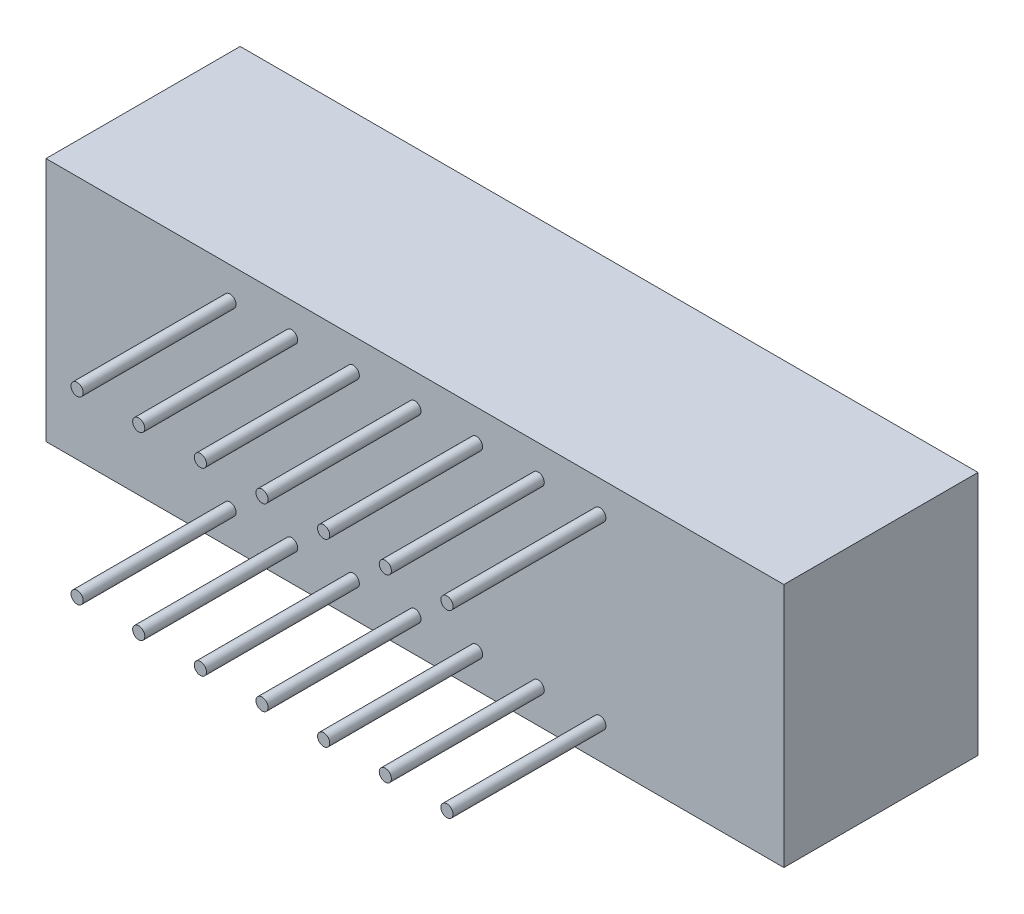
ISO-10303-21;
HEADER;
FILE_DESCRIPTION(('STEP AP214'),'2;1');
FILE_NAME('part.step','',(''),(''),'','','');
FILE_SCHEMA(('AUTOMOTIVE_DESIGN { 1 0 10303 214 1 1 1 1 }'));
ENDSEC;
DATA;
#1=APPLICATION_CONTEXT('core data for automotive mechanical design processes');
#2=APPLICATION_PROTOCOL_DEFINITION('international standard','automotive_design',2000,#1);
#3=PRODUCT_CONTEXT('',#1,'mechanical');
#4=PRODUCT('Part','Part','',(#3));
#5=PRODUCT_RELATED_PRODUCT_CATEGORY('part','',(#4));
#6=PRODUCT_DEFINITION_FORMATION('','',#4);
#7=PRODUCT_DEFINITION_CONTEXT('part definition',#1,'design');
#8=PRODUCT_DEFINITION('design','',#6,#7);
#9=PRODUCT_DEFINITION_SHAPE('','',#8);
#10=(LENGTH_UNIT() NAMED_UNIT(*) SI_UNIT(.MILLI.,.METRE.));
#11=(NAMED_UNIT(*) PLANE_ANGLE_UNIT() SI_UNIT($,.RADIAN.));
#12=(NAMED_UNIT(*) SI_UNIT($,.STERADIAN.) SOLID_ANGLE_UNIT());
#13=UNCERTAINTY_MEASURE_WITH_UNIT(LENGTH_MEASURE(1.E-05),#10,'distance_accuracy_value','');
#14=(GEOMETRIC_REPRESENTATION_CONTEXT(3) GLOBAL_UNCERTAINTY_ASSIGNED_CONTEXT((#13)) GLOBAL_UNIT_ASSIGNED_CONTEXT((#10,
#11,#12)) REPRESENTATION_CONTEXT('',''));
#15=CARTESIAN_POINT('',(0.,0.,0.));
#16=DIRECTION('',(0.,0.,1.));
#17=DIRECTION('',(1.,0.,0.));
#18=AXIS2_PLACEMENT_3D('',#15,#16,#17);
#19=CARTESIAN_POINT('',(0.,0.,8.));
#20=DIRECTION('',(1.,0.,0.));
#21=DIRECTION('',(0.,0.,-1.));
#22=AXIS2_PLACEMENT_3D('',#19,#20,#21);
#23=PLANE('',#22);
#24=DIRECTION('',(0.,-1.,0.));
#25=VECTOR('',#24,1.);
#26=CARTESIAN_POINT('',(0.,0.,0.));
#27=LINE('',#26,#25);
#28=CARTESIAN_POINT('',(0.,10.1,0.));
#29=VERTEX_POINT('',#28);
#30=CARTESIAN_POINT('',(0.,0.,0.));
#31=VERTEX_POINT('',#30);
#32=EDGE_CURVE('E102',#29,#31,#27,.T.);
#33=ORIENTED_EDGE('',*,*,#32,.T.);
#34=DIRECTION('',(0.,0.,-1.));
#35=VECTOR('',#34,1.);
#36=CARTESIAN_POINT('',(0.,0.,8.));
#37=LINE('',#36,#35);
#38=CARTESIAN_POINT('',(0.,0.,8.));
#39=VERTEX_POINT('',#38);
#40=EDGE_CURVE('E93',#39,#31,#37,.T.);
#41=ORIENTED_EDGE('',*,*,#40,.F.);
#42=DIRECTION('',(0.,-1.,0.));
#43=VECTOR('',#42,1.);
#44=CARTESIAN_POINT('',(0.,0.,8.));
#45=LINE('',#44,#43);
#46=CARTESIAN_POINT('',(0.,10.1,8.));
#47=VERTEX_POINT('',#46);
#48=EDGE_CURVE('E87',#47,#39,#45,.T.);
#49=ORIENTED_EDGE('',*,*,#48,.F.);
#50=DIRECTION('',(0.,0.,-1.));
#51=VECTOR('',#50,1.);
#52=CARTESIAN_POINT('',(0.,10.1,8.));
#53=LINE('',#52,#51);
#54=EDGE_CURVE('E98',#47,#29,#53,.T.);
#55=ORIENTED_EDGE('',*,*,#54,.T.);
#56=EDGE_LOOP('',(#33,#41,#49,#55));
#57=FACE_BOUND('',#56,.T.);
#58=ADVANCED_FACE('F35',(#57),#23,.F.);
#59=CARTESIAN_POINT('',(0.,0.,8.));
#60=DIRECTION('',(0.,1.,0.));
#61=DIRECTION('',(0.,0.,1.));
#62=AXIS2_PLACEMENT_3D('',#59,#60,#61);
#63=PLANE('',#62);
#64=DIRECTION('',(1.,0.,0.));
#65=VECTOR('',#64,1.);
#66=CARTESIAN_POINT('',(0.,0.,0.));
#67=LINE('',#66,#65);
#68=CARTESIAN_POINT('',(30.4,0.,0.));
#69=VERTEX_POINT('',#68);
#70=EDGE_CURVE('E92',#31,#69,#67,.T.);
#71=ORIENTED_EDGE('',*,*,#70,.T.);
#72=DIRECTION('',(0.,0.,-1.));
#73=VECTOR('',#72,1.);
#74=CARTESIAN_POINT('',(30.4,0.,8.));
#75=LINE('',#74,#73);
#76=CARTESIAN_POINT('',(30.4,0.,8.));
#77=VERTEX_POINT('',#76);
#78=EDGE_CURVE('E90',#77,#69,#75,.T.);
#79=ORIENTED_EDGE('',*,*,#78,.F.);
#80=DIRECTION('',(1.,0.,0.));
#81=VECTOR('',#80,1.);
#82=CARTESIAN_POINT('',(0.,0.,8.));
#83=LINE('',#82,#81);
#84=EDGE_CURVE('E82',#39,#77,#83,.T.);
#85=ORIENTED_EDGE('',*,*,#84,.F.);
#86=ORIENTED_EDGE('',*,*,#40,.T.);
#87=EDGE_LOOP('',(#71,#79,#85,#86));
#88=FACE_BOUND('',#87,.T.);
#89=ADVANCED_FACE('F91',(#88),#63,.F.);
#90=CARTESIAN_POINT('',(30.4,0.,8.));
#91=DIRECTION('',(-1.,0.,0.));
#92=DIRECTION('',(0.,0.,1.));
#93=AXIS2_PLACEMENT_3D('',#90,#91,#92);
#94=PLANE('',#93);
#95=DIRECTION('',(0.,1.,0.));
#96=VECTOR('',#95,1.);
#97=CARTESIAN_POINT('',(30.4,0.,0.));
#98=LINE('',#97,#96);
#99=CARTESIAN_POINT('',(30.4,10.1,0.));
#100=VERTEX_POINT('',#99);
#101=EDGE_CURVE('E68',#69,#100,#98,.T.);
#102=ORIENTED_EDGE('',*,*,#101,.T.);
#103=DIRECTION('',(0.,0.,-1.));
#104=VECTOR('',#103,1.);
#105=CARTESIAN_POINT('',(30.4,10.1,8.));
#106=LINE('',#105,#104);
#107=CARTESIAN_POINT('',(30.4,10.1,8.));
#108=VERTEX_POINT('',#107);
#109=EDGE_CURVE('E94',#108,#100,#106,.T.);
#110=ORIENTED_EDGE('',*,*,#109,.F.);
#111=DIRECTION('',(0.,1.,0.));
#112=VECTOR('',#111,1.);
#113=CARTESIAN_POINT('',(30.4,0.,8.));
#114=LINE('',#113,#112);
#115=EDGE_CURVE('E85',#77,#108,#114,.T.);
#116=ORIENTED_EDGE('',*,*,#115,.F.);
#117=ORIENTED_EDGE('',*,*,#78,.T.);
#118=EDGE_LOOP('',(#102,#110,#116,#117));
#119=FACE_BOUND('',#118,.T.);
#120=ADVANCED_FACE('F96',(#119),#94,.F.);
#121=CARTESIAN_POINT('',(0.,10.1,8.));
#122=DIRECTION('',(0.,-1.,0.));
#123=DIRECTION('',(0.,0.,-1.));
#124=AXIS2_PLACEMENT_3D('',#121,#122,#123);
#125=PLANE('',#124);
#126=DIRECTION('',(-1.,0.,0.));
#127=VECTOR('',#126,1.);
#128=CARTESIAN_POINT('',(0.,10.1,0.));
#129=LINE('',#128,#127);
#130=EDGE_CURVE('E74',#100,#29,#129,.T.);
#131=ORIENTED_EDGE('',*,*,#130,.T.);
#132=ORIENTED_EDGE('',*,*,#54,.F.);
#133=DIRECTION('',(-1.,0.,0.));
#134=VECTOR('',#133,1.);
#135=CARTESIAN_POINT('',(0.,10.1,8.));
#136=LINE('',#135,#134);
#137=EDGE_CURVE('E51',#108,#47,#136,.T.);
#138=ORIENTED_EDGE('',*,*,#137,.F.);
#139=ORIENTED_EDGE('',*,*,#109,.T.);
#140=EDGE_LOOP('',(#131,#132,#138,#139));
#141=FACE_BOUND('',#140,.T.);
#142=ADVANCED_FACE('F155',(#141),#125,.F.);
#143=CARTESIAN_POINT('',(0.,0.,8.));
#144=DIRECTION('',(0.,0.,-1.));
#145=DIRECTION('',(-1.,0.,0.));
#146=AXIS2_PLACEMENT_3D('',#143,#144,#145);
#147=PLANE('',#146);
#148=CARTESIAN_POINT('',(7.58000000000008,1.385,8.));
#149=DIRECTION('',(0.,0.,-1.));
#150=DIRECTION('',(-1.,0.,0.));
#151=AXIS2_PLACEMENT_3D('',#148,#149,#150);
#152=CIRCLE('',#151,0.25);
#153=CARTESIAN_POINT('',(7.33000000000008,1.385,8.));
#154=VERTEX_POINT('',#153);
#155=EDGE_CURVE('E11',#154,#154,#152,.F.);
#156=ORIENTED_EDGE('',*,*,#155,.F.);
#157=EDGE_LOOP('',(#156));
#158=FACE_BOUND('',#157,.T.);
#159=CARTESIAN_POINT('',(22.8200000000001,1.385,8.));
#160=DIRECTION('',(0.,0.,-1.));
#161=DIRECTION('',(-1.,0.,0.));
#162=AXIS2_PLACEMENT_3D('',#159,#160,#161);
#163=CIRCLE('',#162,0.25);
#164=CARTESIAN_POINT('',(22.5700000000001,1.385,8.));
#165=VERTEX_POINT('',#164);
#166=EDGE_CURVE('E43',#165,#165,#163,.F.);
#167=ORIENTED_EDGE('',*,*,#166,.F.);
#168=EDGE_LOOP('',(#167));
#169=FACE_BOUND('',#168,.T.);
#170=CARTESIAN_POINT('',(20.2800000000001,1.385,8.));
#171=DIRECTION('',(0.,0.,-1.));
#172=DIRECTION('',(-1.,0.,0.));
#173=AXIS2_PLACEMENT_3D('',#170,#171,#172);
#174=CIRCLE('',#173,0.25);
#175=CARTESIAN_POINT('',(20.0300000000001,1.385,8.));
#176=VERTEX_POINT('',#175);
#177=EDGE_CURVE('E145',#176,#176,#174,.F.);
#178=ORIENTED_EDGE('',*,*,#177,.F.);
#179=EDGE_LOOP('',(#178));
#180=FACE_BOUND('',#179,.T.);
#181=CARTESIAN_POINT('',(17.7400000000001,1.385,8.));
#182=DIRECTION('',(0.,0.,-1.));
#183=DIRECTION('',(-1.,0.,0.));
#184=AXIS2_PLACEMENT_3D('',#181,#182,#183);
#185=CIRCLE('',#184,0.25);
#186=CARTESIAN_POINT('',(17.4900000000001,1.385,8.));
#187=VERTEX_POINT('',#186);
#188=EDGE_CURVE('E142',#187,#187,#185,.F.);
#189=ORIENTED_EDGE('',*,*,#188,.F.);
#190=EDGE_LOOP('',(#189));
#191=FACE_BOUND('',#190,.T.);
#192=CARTESIAN_POINT('',(15.2000000000001,1.385,8.));
#193=DIRECTION('',(0.,0.,-1.));
#194=DIRECTION('',(-1.,0.,0.));
#195=AXIS2_PLACEMENT_3D('',#192,#193,#194);
#196=CIRCLE('',#195,0.25);
#197=CARTESIAN_POINT('',(14.9500000000001,1.385,8.));
#198=VERTEX_POINT('',#197);
#199=EDGE_CURVE('E139',#198,#198,#196,.F.);
#200=ORIENTED_EDGE('',*,*,#199,.F.);
#201=EDGE_LOOP('',(#200));
#202=FACE_BOUND('',#201,.T.);
#203=CARTESIAN_POINT('',(12.6600000000001,1.385,8.));
#204=DIRECTION('',(0.,0.,-1.));
#205=DIRECTION('',(-1.,0.,0.));
#206=AXIS2_PLACEMENT_3D('',#203,#204,#205);
#207=CIRCLE('',#206,0.25);
#208=CARTESIAN_POINT('',(12.4100000000001,1.385,8.));
#209=VERTEX_POINT('',#208);
#210=EDGE_CURVE('E136',#209,#209,#207,.F.);
#211=ORIENTED_EDGE('',*,*,#210,.F.);
#212=EDGE_LOOP('',(#211));
#213=FACE_BOUND('',#212,.T.);
#214=CARTESIAN_POINT('',(10.1200000000001,1.385,8.));
#215=DIRECTION('',(0.,0.,-1.));
#216=DIRECTION('',(-1.,0.,0.));
#217=AXIS2_PLACEMENT_3D('',#214,#215,#216);
#218=CIRCLE('',#217,0.25);
#219=CARTESIAN_POINT('',(9.87000000000008,1.385,8.));
#220=VERTEX_POINT('',#219);
#221=EDGE_CURVE('E133',#220,#220,#218,.F.);
#222=ORIENTED_EDGE('',*,*,#221,.F.);
#223=EDGE_LOOP('',(#222));
#224=FACE_BOUND('',#223,.T.);
#225=CARTESIAN_POINT('',(22.82,8.805,8.));
#226=DIRECTION('',(0.,0.,-1.));
#227=DIRECTION('',(-1.,0.,0.));
#228=AXIS2_PLACEMENT_3D('',#225,#226,#227);
#229=CIRCLE('',#228,0.25);
#230=CARTESIAN_POINT('',(22.57,8.805,8.));
#231=VERTEX_POINT('',#230);
#232=EDGE_CURVE('E130',#231,#231,#229,.F.);
#233=ORIENTED_EDGE('',*,*,#232,.F.);
#234=EDGE_LOOP('',(#233));
#235=FACE_BOUND('',#234,.T.);
#236=CARTESIAN_POINT('',(20.28,8.805,8.));
#237=DIRECTION('',(0.,0.,-1.));
#238=DIRECTION('',(-1.,0.,0.));
#239=AXIS2_PLACEMENT_3D('',#236,#237,#238);
#240=CIRCLE('',#239,0.25);
#241=CARTESIAN_POINT('',(20.03,8.805,8.));
#242=VERTEX_POINT('',#241);
#243=EDGE_CURVE('E127',#242,#242,#240,.F.);
#244=ORIENTED_EDGE('',*,*,#243,.F.);
#245=EDGE_LOOP('',(#244));
#246=FACE_BOUND('',#245,.T.);
#247=CARTESIAN_POINT('',(17.74,8.805,8.));
#248=DIRECTION('',(0.,0.,-1.));
#249=DIRECTION('',(-1.,0.,0.));
#250=AXIS2_PLACEMENT_3D('',#247,#248,#249);
#251=CIRCLE('',#250,0.25);
#252=CARTESIAN_POINT('',(17.49,8.805,8.));
#253=VERTEX_POINT('',#252);
#254=EDGE_CURVE('E124',#253,#253,#251,.F.);
#255=ORIENTED_EDGE('',*,*,#254,.F.);
#256=EDGE_LOOP('',(#255));
#257=FACE_BOUND('',#256,.T.);
#258=CARTESIAN_POINT('',(15.2,8.805,8.));
#259=DIRECTION('',(0.,0.,-1.));
#260=DIRECTION('',(-1.,0.,0.));
#261=AXIS2_PLACEMENT_3D('',#258,#259,#260);
#262=CIRCLE('',#261,0.25);
#263=CARTESIAN_POINT('',(14.95,8.805,8.));
#264=VERTEX_POINT('',#263);
#265=EDGE_CURVE('E121',#264,#264,#262,.F.);
#266=ORIENTED_EDGE('',*,*,#265,.F.);
#267=EDGE_LOOP('',(#266));
#268=FACE_BOUND('',#267,.T.);
#269=CARTESIAN_POINT('',(12.66,8.805,8.));
#270=DIRECTION('',(0.,0.,-1.));
#271=DIRECTION('',(-1.,0.,0.));
#272=AXIS2_PLACEMENT_3D('',#269,#270,#271);
#273=CIRCLE('',#272,0.25);
#274=CARTESIAN_POINT('',(12.41,8.805,8.));
#275=VERTEX_POINT('',#274);
#276=EDGE_CURVE('E118',#275,#275,#273,.F.);
#277=ORIENTED_EDGE('',*,*,#276,.F.);
#278=EDGE_LOOP('',(#277));
#279=FACE_BOUND('',#278,.T.);
#280=CARTESIAN_POINT('',(10.12,8.805,8.));
#281=DIRECTION('',(0.,0.,-1.));
#282=DIRECTION('',(-1.,0.,0.));
#283=AXIS2_PLACEMENT_3D('',#280,#281,#282);
#284=CIRCLE('',#283,0.25);
#285=CARTESIAN_POINT('',(9.87,8.805,8.));
#286=VERTEX_POINT('',#285);
#287=EDGE_CURVE('E115',#286,#286,#284,.F.);
#288=ORIENTED_EDGE('',*,*,#287,.F.);
#289=EDGE_LOOP('',(#288));
#290=FACE_BOUND('',#289,.T.);
#291=CARTESIAN_POINT('',(7.58,8.805,8.));
#292=DIRECTION('',(0.,0.,-1.));
#293=DIRECTION('',(-1.,0.,0.));
#294=AXIS2_PLACEMENT_3D('',#291,#292,#293);
#295=CIRCLE('',#294,0.25);
#296=CARTESIAN_POINT('',(7.33,8.805,8.));
#297=VERTEX_POINT('',#296);
#298=EDGE_CURVE('E112',#297,#297,#295,.F.);
#299=ORIENTED_EDGE('',*,*,#298,.F.);
#300=EDGE_LOOP('',(#299));
#301=FACE_BOUND('',#300,.T.);
#302=ORIENTED_EDGE('',*,*,#48,.T.);
#303=ORIENTED_EDGE('',*,*,#84,.T.);
#304=ORIENTED_EDGE('',*,*,#115,.T.);
#305=ORIENTED_EDGE('',*,*,#137,.T.);
#306=EDGE_LOOP('',(#302,#303,#304,#305));
#307=FACE_BOUND('',#306,.T.);
#308=ADVANCED_FACE('F83',(#158,#169,#180,#191,#202,#213,#224,#235,#246,#257,#268,#279,#290,#301,
#307),#147,.F.);
#309=CARTESIAN_POINT('',(0.,0.,0.));
#310=DIRECTION('',(0.,0.,-1.));
#311=DIRECTION('',(-1.,0.,0.));
#312=AXIS2_PLACEMENT_3D('',#309,#310,#311);
#313=PLANE('',#312);
#314=ORIENTED_EDGE('',*,*,#32,.F.);
#315=ORIENTED_EDGE('',*,*,#130,.F.);
#316=ORIENTED_EDGE('',*,*,#101,.F.);
#317=ORIENTED_EDGE('',*,*,#70,.F.);
#318=EDGE_LOOP('',(#314,#315,#316,#317));
#319=FACE_BOUND('',#318,.T.);
#320=ADVANCED_FACE('F154',(#319),#313,.T.);
#321=CARTESIAN_POINT('',(7.58,8.805,14.3));
#322=DIRECTION('',(0.,0.,-1.));
#323=DIRECTION('',(-1.,0.,0.));
#324=AXIS2_PLACEMENT_3D('',#321,#322,#323);
#325=CYLINDRICAL_SURFACE('',#324,0.25);
#326=CARTESIAN_POINT('',(7.58,8.805,14.3));
#327=DIRECTION('',(0.,0.,1.));
#328=DIRECTION('',(1.,0.,0.));
#329=AXIS2_PLACEMENT_3D('',#326,#327,#328);
#330=CIRCLE('',#329,0.25);
#331=CARTESIAN_POINT('',(7.83,8.805,14.3));
#332=VERTEX_POINT('',#331);
#333=EDGE_CURVE('E105',#332,#332,#330,.T.);
#334=ORIENTED_EDGE('',*,*,#333,.F.);
#335=EDGE_LOOP('',(#334));
#336=FACE_BOUND('',#335,.T.);
#337=ORIENTED_EDGE('',*,*,#298,.T.);
#338=EDGE_LOOP('',(#337));
#339=FACE_BOUND('',#338,.T.);
#340=ADVANCED_FACE('F182',(#336,#339),#325,.T.);
#341=CARTESIAN_POINT('',(7.58,8.805,14.3));
#342=DIRECTION('',(0.,0.,1.));
#343=DIRECTION('',(1.,0.,0.));
#344=AXIS2_PLACEMENT_3D('',#341,#342,#343);
#345=PLANE('',#344);
#346=ORIENTED_EDGE('',*,*,#333,.T.);
#347=EDGE_LOOP('',(#346));
#348=FACE_BOUND('',#347,.T.);
#349=ADVANCED_FACE('F184',(#348),#345,.T.);
#350=CARTESIAN_POINT('',(10.12,8.805,14.3));
#351=DIRECTION('',(0.,0.,-1.));
#352=DIRECTION('',(-1.,0.,0.));
#353=AXIS2_PLACEMENT_3D('',#350,#351,#352);
#354=CYLINDRICAL_SURFACE('',#353,0.25);
#355=CARTESIAN_POINT('',(10.12,8.805,14.3));
#356=DIRECTION('',(0.,0.,1.));
#357=DIRECTION('',(1.,0.,0.));
#358=AXIS2_PLACEMENT_3D('',#355,#356,#357);
#359=CIRCLE('',#358,0.25);
#360=CARTESIAN_POINT('',(10.37,8.805,14.3));
#361=VERTEX_POINT('',#360);
#362=EDGE_CURVE('E545',#361,#361,#359,.T.);
#363=ORIENTED_EDGE('',*,*,#362,.F.);
#364=EDGE_LOOP('',(#363));
#365=FACE_BOUND('',#364,.T.);
#366=ORIENTED_EDGE('',*,*,#287,.T.);
#367=EDGE_LOOP('',(#366));
#368=FACE_BOUND('',#367,.T.);
#369=ADVANCED_FACE('F191',(#365,#368),#354,.T.);
#370=CARTESIAN_POINT('',(10.12,8.805,14.3));
#371=DIRECTION('',(0.,0.,1.));
#372=DIRECTION('',(1.,0.,0.));
#373=AXIS2_PLACEMENT_3D('',#370,#371,#372);
#374=PLANE('',#373);
#375=ORIENTED_EDGE('',*,*,#362,.T.);
#376=EDGE_LOOP('',(#375));
#377=FACE_BOUND('',#376,.T.);
#378=ADVANCED_FACE('F254',(#377),#374,.T.);
#379=CARTESIAN_POINT('',(12.66,8.805,14.3));
#380=DIRECTION('',(0.,0.,-1.));
#381=DIRECTION('',(-1.,0.,0.));
#382=AXIS2_PLACEMENT_3D('',#379,#380,#381);
#383=CYLINDRICAL_SURFACE('',#382,0.25);
#384=CARTESIAN_POINT('',(12.66,8.805,14.3));
#385=DIRECTION('',(0.,0.,1.));
#386=DIRECTION('',(1.,0.,0.));
#387=AXIS2_PLACEMENT_3D('',#384,#385,#386);
#388=CIRCLE('',#387,0.25);
#389=CARTESIAN_POINT('',(12.91,8.805,14.3));
#390=VERTEX_POINT('',#389);
#391=EDGE_CURVE('E542',#390,#390,#388,.T.);
#392=ORIENTED_EDGE('',*,*,#391,.F.);
#393=EDGE_LOOP('',(#392));
#394=FACE_BOUND('',#393,.T.);
#395=ORIENTED_EDGE('',*,*,#276,.T.);
#396=EDGE_LOOP('',(#395));
#397=FACE_BOUND('',#396,.T.);
#398=ADVANCED_FACE('F263',(#394,#397),#383,.T.);
#399=CARTESIAN_POINT('',(12.66,8.805,14.3));
#400=DIRECTION('',(0.,0.,1.));
#401=DIRECTION('',(1.,0.,0.));
#402=AXIS2_PLACEMENT_3D('',#399,#400,#401);
#403=PLANE('',#402);
#404=ORIENTED_EDGE('',*,*,#391,.T.);
#405=EDGE_LOOP('',(#404));
#406=FACE_BOUND('',#405,.T.);
#407=ADVANCED_FACE('F272',(#406),#403,.T.);
#408=CARTESIAN_POINT('',(15.2,8.805,14.3));
#409=DIRECTION('',(0.,0.,-1.));
#410=DIRECTION('',(-1.,0.,0.));
#411=AXIS2_PLACEMENT_3D('',#408,#409,#410);
#412=CYLINDRICAL_SURFACE('',#411,0.25);
#413=CARTESIAN_POINT('',(15.2,8.805,14.3));
#414=DIRECTION('',(0.,0.,1.));
#415=DIRECTION('',(1.,0.,0.));
#416=AXIS2_PLACEMENT_3D('',#413,#414,#415);
#417=CIRCLE('',#416,0.25);
#418=CARTESIAN_POINT('',(15.45,8.805,14.3));
#419=VERTEX_POINT('',#418);
#420=EDGE_CURVE('E539',#419,#419,#417,.T.);
#421=ORIENTED_EDGE('',*,*,#420,.F.);
#422=EDGE_LOOP('',(#421));
#423=FACE_BOUND('',#422,.T.);
#424=ORIENTED_EDGE('',*,*,#265,.T.);
#425=EDGE_LOOP('',(#424));
#426=FACE_BOUND('',#425,.T.);
#427=ADVANCED_FACE('F281',(#423,#426),#412,.T.);
#428=CARTESIAN_POINT('',(15.2,8.805,14.3));
#429=DIRECTION('',(0.,0.,1.));
#430=DIRECTION('',(1.,0.,0.));
#431=AXIS2_PLACEMENT_3D('',#428,#429,#430);
#432=PLANE('',#431);
#433=ORIENTED_EDGE('',*,*,#420,.T.);
#434=EDGE_LOOP('',(#433));
#435=FACE_BOUND('',#434,.T.);
#436=ADVANCED_FACE('F290',(#435),#432,.T.);
#437=CARTESIAN_POINT('',(17.74,8.805,14.3));
#438=DIRECTION('',(0.,0.,-1.));
#439=DIRECTION('',(-1.,0.,0.));
#440=AXIS2_PLACEMENT_3D('',#437,#438,#439);
#441=CYLINDRICAL_SURFACE('',#440,0.25);
#442=CARTESIAN_POINT('',(17.74,8.805,14.3));
#443=DIRECTION('',(0.,0.,1.));
#444=DIRECTION('',(1.,0.,0.));
#445=AXIS2_PLACEMENT_3D('',#442,#443,#444);
#446=CIRCLE('',#445,0.25);
#447=CARTESIAN_POINT('',(17.99,8.805,14.3));
#448=VERTEX_POINT('',#447);
#449=EDGE_CURVE('E536',#448,#448,#446,.T.);
#450=ORIENTED_EDGE('',*,*,#449,.F.);
#451=EDGE_LOOP('',(#450));
#452=FACE_BOUND('',#451,.T.);
#453=ORIENTED_EDGE('',*,*,#254,.T.);
#454=EDGE_LOOP('',(#453));
#455=FACE_BOUND('',#454,.T.);
#456=ADVANCED_FACE('F299',(#452,#455),#441,.T.);
#457=CARTESIAN_POINT('',(17.74,8.805,14.3));
#458=DIRECTION('',(0.,0.,1.));
#459=DIRECTION('',(1.,0.,0.));
#460=AXIS2_PLACEMENT_3D('',#457,#458,#459);
#461=PLANE('',#460);
#462=ORIENTED_EDGE('',*,*,#449,.T.);
#463=EDGE_LOOP('',(#462));
#464=FACE_BOUND('',#463,.T.);
#465=ADVANCED_FACE('F308',(#464),#461,.T.);
#466=CARTESIAN_POINT('',(20.28,8.805,14.3));
#467=DIRECTION('',(0.,0.,-1.));
#468=DIRECTION('',(-1.,0.,0.));
#469=AXIS2_PLACEMENT_3D('',#466,#467,#468);
#470=CYLINDRICAL_SURFACE('',#469,0.25);
#471=CARTESIAN_POINT('',(20.28,8.805,14.3));
#472=DIRECTION('',(0.,0.,1.));
#473=DIRECTION('',(1.,0.,0.));
#474=AXIS2_PLACEMENT_3D('',#471,#472,#473);
#475=CIRCLE('',#474,0.25);
#476=CARTESIAN_POINT('',(20.53,8.805,14.3));
#477=VERTEX_POINT('',#476);
#478=EDGE_CURVE('E533',#477,#477,#475,.T.);
#479=ORIENTED_EDGE('',*,*,#478,.F.);
#480=EDGE_LOOP('',(#479));
#481=FACE_BOUND('',#480,.T.);
#482=ORIENTED_EDGE('',*,*,#243,.T.);
#483=EDGE_LOOP('',(#482));
#484=FACE_BOUND('',#483,.T.);
#485=ADVANCED_FACE('F317',(#481,#484),#470,.T.);
#486=CARTESIAN_POINT('',(20.28,8.805,14.3));
#487=DIRECTION('',(0.,0.,1.));
#488=DIRECTION('',(1.,0.,0.));
#489=AXIS2_PLACEMENT_3D('',#486,#487,#488);
#490=PLANE('',#489);
#491=ORIENTED_EDGE('',*,*,#478,.T.);
#492=EDGE_LOOP('',(#491));
#493=FACE_BOUND('',#492,.T.);
#494=ADVANCED_FACE('F326',(#493),#490,.T.);
#495=CARTESIAN_POINT('',(22.82,8.805,14.3));
#496=DIRECTION('',(0.,0.,-1.));
#497=DIRECTION('',(-1.,0.,0.));
#498=AXIS2_PLACEMENT_3D('',#495,#496,#497);
#499=CYLINDRICAL_SURFACE('',#498,0.25);
#500=CARTESIAN_POINT('',(22.82,8.805,14.3));
#501=DIRECTION('',(0.,0.,1.));
#502=DIRECTION('',(1.,0.,0.));
#503=AXIS2_PLACEMENT_3D('',#500,#501,#502);
#504=CIRCLE('',#503,0.25);
#505=CARTESIAN_POINT('',(23.07,8.805,14.3));
#506=VERTEX_POINT('',#505);
#507=EDGE_CURVE('E530',#506,#506,#504,.T.);
#508=ORIENTED_EDGE('',*,*,#507,.F.);
#509=EDGE_LOOP('',(#508));
#510=FACE_BOUND('',#509,.T.);
#511=ORIENTED_EDGE('',*,*,#232,.T.);
#512=EDGE_LOOP('',(#511));
#513=FACE_BOUND('',#512,.T.);
#514=ADVANCED_FACE('F335',(#510,#513),#499,.T.);
#515=CARTESIAN_POINT('',(22.82,8.805,14.3));
#516=DIRECTION('',(0.,0.,1.));
#517=DIRECTION('',(1.,0.,0.));
#518=AXIS2_PLACEMENT_3D('',#515,#516,#517);
#519=PLANE('',#518);
#520=ORIENTED_EDGE('',*,*,#507,.T.);
#521=EDGE_LOOP('',(#520));
#522=FACE_BOUND('',#521,.T.);
#523=ADVANCED_FACE('F344',(#522),#519,.T.);
#524=CARTESIAN_POINT('',(10.1200000000001,1.385,14.3));
#525=DIRECTION('',(0.,0.,-1.));
#526=DIRECTION('',(-1.,0.,0.));
#527=AXIS2_PLACEMENT_3D('',#524,#525,#526);
#528=CYLINDRICAL_SURFACE('',#527,0.25);
#529=CARTESIAN_POINT('',(10.1200000000001,1.385,14.3));
#530=DIRECTION('',(0.,0.,1.));
#531=DIRECTION('',(1.,0.,0.));
#532=AXIS2_PLACEMENT_3D('',#529,#530,#531);
#533=CIRCLE('',#532,0.25);
#534=CARTESIAN_POINT('',(10.3700000000001,1.385,14.3));
#535=VERTEX_POINT('',#534);
#536=EDGE_CURVE('E527',#535,#535,#533,.T.);
#537=ORIENTED_EDGE('',*,*,#536,.F.);
#538=EDGE_LOOP('',(#537));
#539=FACE_BOUND('',#538,.T.);
#540=ORIENTED_EDGE('',*,*,#221,.T.);
#541=EDGE_LOOP('',(#540));
#542=FACE_BOUND('',#541,.T.);
#543=ADVANCED_FACE('F353',(#539,#542),#528,.T.);
#544=CARTESIAN_POINT('',(10.1200000000001,1.385,14.3));
#545=DIRECTION('',(0.,0.,1.));
#546=DIRECTION('',(1.,0.,0.));
#547=AXIS2_PLACEMENT_3D('',#544,#545,#546);
#548=PLANE('',#547);
#549=ORIENTED_EDGE('',*,*,#536,.T.);
#550=EDGE_LOOP('',(#549));
#551=FACE_BOUND('',#550,.T.);
#552=ADVANCED_FACE('F362',(#551),#548,.T.);
#553=CARTESIAN_POINT('',(12.6600000000001,1.385,14.3));
#554=DIRECTION('',(0.,0.,-1.));
#555=DIRECTION('',(-1.,0.,0.));
#556=AXIS2_PLACEMENT_3D('',#553,#554,#555);
#557=CYLINDRICAL_SURFACE('',#556,0.25);
#558=CARTESIAN_POINT('',(12.6600000000001,1.385,14.3));
#559=DIRECTION('',(0.,0.,1.));
#560=DIRECTION('',(1.,0.,0.));
#561=AXIS2_PLACEMENT_3D('',#558,#559,#560);
#562=CIRCLE('',#561,0.25);
#563=CARTESIAN_POINT('',(12.9100000000001,1.385,14.3));
#564=VERTEX_POINT('',#563);
#565=EDGE_CURVE('E524',#564,#564,#562,.T.);
#566=ORIENTED_EDGE('',*,*,#565,.F.);
#567=EDGE_LOOP('',(#566));
#568=FACE_BOUND('',#567,.T.);
#569=ORIENTED_EDGE('',*,*,#210,.T.);
#570=EDGE_LOOP('',(#569));
#571=FACE_BOUND('',#570,.T.);
#572=ADVANCED_FACE('F371',(#568,#571),#557,.T.);
#573=CARTESIAN_POINT('',(12.6600000000001,1.385,14.3));
#574=DIRECTION('',(0.,0.,1.));
#575=DIRECTION('',(1.,0.,0.));
#576=AXIS2_PLACEMENT_3D('',#573,#574,#575);
#577=PLANE('',#576);
#578=ORIENTED_EDGE('',*,*,#565,.T.);
#579=EDGE_LOOP('',(#578));
#580=FACE_BOUND('',#579,.T.);
#581=ADVANCED_FACE('F380',(#580),#577,.T.);
#582=CARTESIAN_POINT('',(15.2000000000001,1.385,14.3));
#583=DIRECTION('',(0.,0.,-1.));
#584=DIRECTION('',(-1.,0.,0.));
#585=AXIS2_PLACEMENT_3D('',#582,#583,#584);
#586=CYLINDRICAL_SURFACE('',#585,0.25);
#587=CARTESIAN_POINT('',(15.2000000000001,1.385,14.3));
#588=DIRECTION('',(0.,0.,1.));
#589=DIRECTION('',(1.,0.,0.));
#590=AXIS2_PLACEMENT_3D('',#587,#588,#589);
#591=CIRCLE('',#590,0.25);
#592=CARTESIAN_POINT('',(15.4500000000001,1.385,14.3));
#593=VERTEX_POINT('',#592);
#594=EDGE_CURVE('E521',#593,#593,#591,.T.);
#595=ORIENTED_EDGE('',*,*,#594,.F.);
#596=EDGE_LOOP('',(#595));
#597=FACE_BOUND('',#596,.T.);
#598=ORIENTED_EDGE('',*,*,#199,.T.);
#599=EDGE_LOOP('',(#598));
#600=FACE_BOUND('',#599,.T.);
#601=ADVANCED_FACE('F389',(#597,#600),#586,.T.);
#602=CARTESIAN_POINT('',(15.2000000000001,1.385,14.3));
#603=DIRECTION('',(0.,0.,1.));
#604=DIRECTION('',(1.,0.,0.));
#605=AXIS2_PLACEMENT_3D('',#602,#603,#604);
#606=PLANE('',#605);
#607=ORIENTED_EDGE('',*,*,#594,.T.);
#608=EDGE_LOOP('',(#607));
#609=FACE_BOUND('',#608,.T.);
#610=ADVANCED_FACE('F398',(#609),#606,.T.);
#611=CARTESIAN_POINT('',(17.7400000000001,1.385,14.3));
#612=DIRECTION('',(0.,0.,-1.));
#613=DIRECTION('',(-1.,0.,0.));
#614=AXIS2_PLACEMENT_3D('',#611,#612,#613);
#615=CYLINDRICAL_SURFACE('',#614,0.25);
#616=CARTESIAN_POINT('',(17.7400000000001,1.385,14.3));
#617=DIRECTION('',(0.,0.,1.));
#618=DIRECTION('',(1.,0.,0.));
#619=AXIS2_PLACEMENT_3D('',#616,#617,#618);
#620=CIRCLE('',#619,0.25);
#621=CARTESIAN_POINT('',(17.9900000000001,1.385,14.3));
#622=VERTEX_POINT('',#621);
#623=EDGE_CURVE('E518',#622,#622,#620,.T.);
#624=ORIENTED_EDGE('',*,*,#623,.F.);
#625=EDGE_LOOP('',(#624));
#626=FACE_BOUND('',#625,.T.);
#627=ORIENTED_EDGE('',*,*,#188,.T.);
#628=EDGE_LOOP('',(#627));
#629=FACE_BOUND('',#628,.T.);
#630=ADVANCED_FACE('F407',(#626,#629),#615,.T.);
#631=CARTESIAN_POINT('',(17.7400000000001,1.385,14.3));
#632=DIRECTION('',(0.,0.,1.));
#633=DIRECTION('',(1.,0.,0.));
#634=AXIS2_PLACEMENT_3D('',#631,#632,#633);
#635=PLANE('',#634);
#636=ORIENTED_EDGE('',*,*,#623,.T.);
#637=EDGE_LOOP('',(#636));
#638=FACE_BOUND('',#637,.T.);
#639=ADVANCED_FACE('F416',(#638),#635,.T.);
#640=CARTESIAN_POINT('',(20.2800000000001,1.385,14.3));
#641=DIRECTION('',(0.,0.,-1.));
#642=DIRECTION('',(-1.,0.,0.));
#643=AXIS2_PLACEMENT_3D('',#640,#641,#642);
#644=CYLINDRICAL_SURFACE('',#643,0.25);
#645=CARTESIAN_POINT('',(20.2800000000001,1.385,14.3));
#646=DIRECTION('',(0.,0.,1.));
#647=DIRECTION('',(1.,0.,0.));
#648=AXIS2_PLACEMENT_3D('',#645,#646,#647);
#649=CIRCLE('',#648,0.25);
#650=CARTESIAN_POINT('',(20.5300000000001,1.385,14.3));
#651=VERTEX_POINT('',#650);
#652=EDGE_CURVE('E513',#651,#651,#649,.T.);
#653=ORIENTED_EDGE('',*,*,#652,.F.);
#654=EDGE_LOOP('',(#653));
#655=FACE_BOUND('',#654,.T.);
#656=ORIENTED_EDGE('',*,*,#177,.T.);
#657=EDGE_LOOP('',(#656));
#658=FACE_BOUND('',#657,.T.);
#659=ADVANCED_FACE('F425',(#655,#658),#644,.T.);
#660=CARTESIAN_POINT('',(20.2800000000001,1.385,14.3));
#661=DIRECTION('',(0.,0.,1.));
#662=DIRECTION('',(1.,0.,0.));
#663=AXIS2_PLACEMENT_3D('',#660,#661,#662);
#664=PLANE('',#663);
#665=ORIENTED_EDGE('',*,*,#652,.T.);
#666=EDGE_LOOP('',(#665));
#667=FACE_BOUND('',#666,.T.);
#668=ADVANCED_FACE('F434',(#667),#664,.T.);
#669=CARTESIAN_POINT('',(22.8200000000001,1.385,14.3));
#670=DIRECTION('',(0.,0.,-1.));
#671=DIRECTION('',(-1.,0.,0.));
#672=AXIS2_PLACEMENT_3D('',#669,#670,#671);
#673=CYLINDRICAL_SURFACE('',#672,0.25);
#674=CARTESIAN_POINT('',(22.8200000000001,1.385,14.3));
#675=DIRECTION('',(0.,0.,1.));
#676=DIRECTION('',(1.,0.,0.));
#677=AXIS2_PLACEMENT_3D('',#674,#675,#676);
#678=CIRCLE('',#677,0.25);
#679=CARTESIAN_POINT('',(23.0700000000001,1.385,14.3));
#680=VERTEX_POINT('',#679);
#681=EDGE_CURVE('E510',#680,#680,#678,.T.);
#682=ORIENTED_EDGE('',*,*,#681,.F.);
#683=EDGE_LOOP('',(#682));
#684=FACE_BOUND('',#683,.T.);
#685=ORIENTED_EDGE('',*,*,#166,.T.);
#686=EDGE_LOOP('',(#685));
#687=FACE_BOUND('',#686,.T.);
#688=ADVANCED_FACE('F150',(#684,#687),#673,.T.);
#689=CARTESIAN_POINT('',(22.8200000000001,1.385,14.3));
#690=DIRECTION('',(0.,0.,1.));
#691=DIRECTION('',(1.,0.,0.));
#692=AXIS2_PLACEMENT_3D('',#689,#690,#691);
#693=PLANE('',#692);
#694=ORIENTED_EDGE('',*,*,#681,.T.);
#695=EDGE_LOOP('',(#694));
#696=FACE_BOUND('',#695,.T.);
#697=ADVANCED_FACE('F451',(#696),#693,.T.);
#698=CARTESIAN_POINT('',(7.58000000000008,1.385,14.3));
#699=DIRECTION('',(0.,0.,-1.));
#700=DIRECTION('',(-1.,0.,0.));
#701=AXIS2_PLACEMENT_3D('',#698,#699,#700);
#702=CYLINDRICAL_SURFACE('',#701,0.25);
#703=CARTESIAN_POINT('',(7.58000000000008,1.385,14.3));
#704=DIRECTION('',(0.,0.,1.));
#705=DIRECTION('',(1.,0.,0.));
#706=AXIS2_PLACEMENT_3D('',#703,#704,#705);
#707=CIRCLE('',#706,0.25);
#708=CARTESIAN_POINT('',(7.83000000000008,1.385,14.3));
#709=VERTEX_POINT('',#708);
#710=EDGE_CURVE('E509',#709,#709,#707,.T.);
#711=ORIENTED_EDGE('',*,*,#710,.F.);
#712=EDGE_LOOP('',(#711));
#713=FACE_BOUND('',#712,.T.);
#714=ORIENTED_EDGE('',*,*,#155,.T.);
#715=EDGE_LOOP('',(#714));
#716=FACE_BOUND('',#715,.T.);
#717=ADVANCED_FACE('F460',(#713,#716),#702,.T.);
#718=CARTESIAN_POINT('',(7.58000000000008,1.385,14.3));
#719=DIRECTION('',(0.,0.,1.));
#720=DIRECTION('',(1.,0.,0.));
#721=AXIS2_PLACEMENT_3D('',#718,#719,#720);
#722=PLANE('',#721);
#723=ORIENTED_EDGE('',*,*,#710,.T.);
#724=EDGE_LOOP('',(#723));
#725=FACE_BOUND('',#724,.T.);
#726=ADVANCED_FACE('F469',(#725),#722,.T.);
#727=CLOSED_SHELL('',(#58,#89,#120,#142,#308,#320,#340,#349,#369,#378,#398,#407,#427,#436,#456,
#465,#485,#494,#514,#523,#543,#552,#572,#581,#601,#610,#630,#639,#659,#668,#688,#697,#717,#726));
#728=MANIFOLD_SOLID_BREP('B2',#727);
#729=ADVANCED_BREP_SHAPE_REPRESENTATION('',(#18,#728),#14);
#730=SHAPE_DEFINITION_REPRESENTATION(#9,#729);
ENDSEC;
END-ISO-10303-21;
